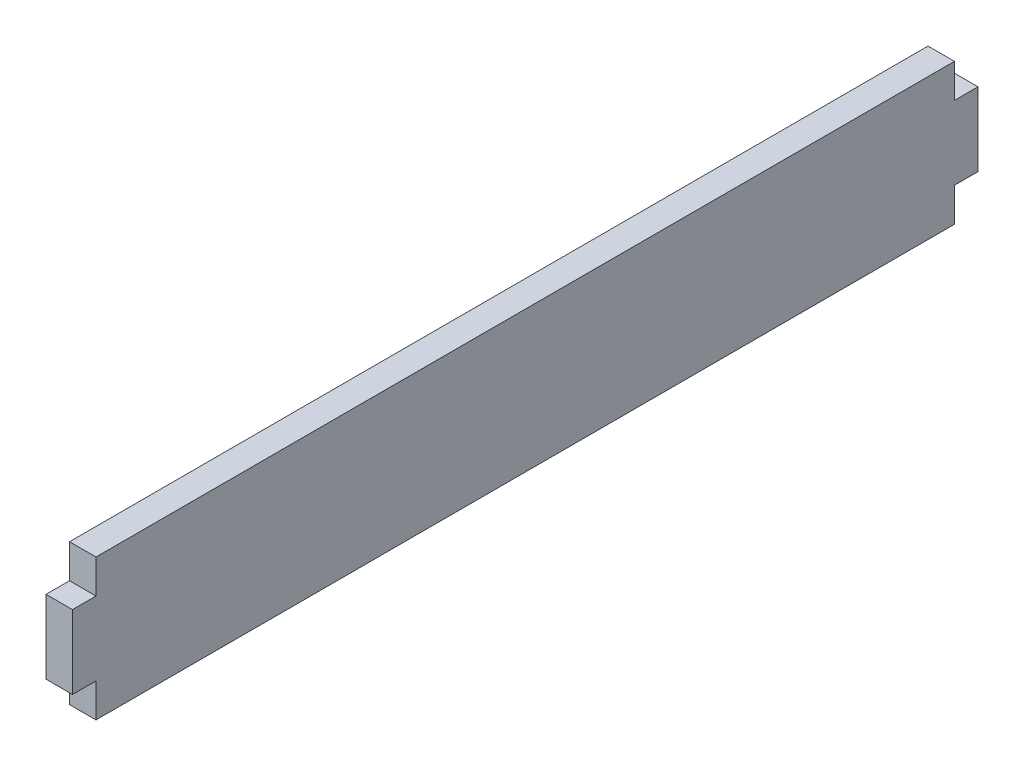
ISO-10303-21;
HEADER;
FILE_DESCRIPTION(('STEP AP214'),'2;1');
FILE_NAME('part.step','',(''),(''),'','','');
FILE_SCHEMA(('AUTOMOTIVE_DESIGN { 1 0 10303 214 1 1 1 1 }'));
ENDSEC;
DATA;
#1=APPLICATION_CONTEXT('core data for automotive mechanical design processes');
#2=APPLICATION_PROTOCOL_DEFINITION('international standard','automotive_design',2000,#1);
#3=PRODUCT_CONTEXT('',#1,'mechanical');
#4=PRODUCT('Part','Part','',(#3));
#5=PRODUCT_RELATED_PRODUCT_CATEGORY('part','',(#4));
#6=PRODUCT_DEFINITION_FORMATION('','',#4);
#7=PRODUCT_DEFINITION_CONTEXT('part definition',#1,'design');
#8=PRODUCT_DEFINITION('design','',#6,#7);
#9=PRODUCT_DEFINITION_SHAPE('','',#8);
#10=(LENGTH_UNIT() NAMED_UNIT(*) SI_UNIT(.MILLI.,.METRE.));
#11=(NAMED_UNIT(*) PLANE_ANGLE_UNIT() SI_UNIT($,.RADIAN.));
#12=(NAMED_UNIT(*) SI_UNIT($,.STERADIAN.) SOLID_ANGLE_UNIT());
#13=UNCERTAINTY_MEASURE_WITH_UNIT(LENGTH_MEASURE(1.E-05),#10,'distance_accuracy_value','');
#14=(GEOMETRIC_REPRESENTATION_CONTEXT(3) GLOBAL_UNCERTAINTY_ASSIGNED_CONTEXT((#13)) GLOBAL_UNIT_ASSIGNED_CONTEXT((#10,
#11,#12)) REPRESENTATION_CONTEXT('',''));
#15=CARTESIAN_POINT('',(0.,0.,0.));
#16=DIRECTION('',(0.,0.,1.));
#17=DIRECTION('',(1.,0.,0.));
#18=AXIS2_PLACEMENT_3D('',#15,#16,#17);
#19=CARTESIAN_POINT('',(18.,148.246124222782,20.354138571395));
#20=DIRECTION('',(0.,0.,-1.));
#21=DIRECTION('',(0.,1.,0.));
#22=AXIS2_PLACEMENT_3D('',#19,#20,#21);
#23=PLANE('',#22);
#24=DIRECTION('',(0.,-1.,0.));
#25=VECTOR('',#24,1.);
#26=CARTESIAN_POINT('',(0.,148.246124222782,20.354138571395));
#27=LINE('',#26,#25);
#28=CARTESIAN_POINT('',(0.,148.246124222782,20.354138571395));
#29=VERTEX_POINT('',#28);
#30=CARTESIAN_POINT('',(0.,125.246124222782,20.354138571395));
#31=VERTEX_POINT('',#30);
#32=EDGE_CURVE('E153',#29,#31,#27,.T.);
#33=ORIENTED_EDGE('',*,*,#32,.T.);
#34=DIRECTION('',(-1.,0.,0.));
#35=VECTOR('',#34,1.);
#36=CARTESIAN_POINT('',(18.,125.246124222782,20.354138571395));
#37=LINE('',#36,#35);
#38=CARTESIAN_POINT('',(18.,125.246124222782,20.354138571395));
#39=VERTEX_POINT('',#38);
#40=EDGE_CURVE('E11',#39,#31,#37,.T.);
#41=ORIENTED_EDGE('',*,*,#40,.F.);
#42=DIRECTION('',(0.,-1.,0.));
#43=VECTOR('',#42,1.);
#44=CARTESIAN_POINT('',(18.,148.246124222782,20.354138571395));
#45=LINE('',#44,#43);
#46=CARTESIAN_POINT('',(18.,148.246124222782,20.354138571395));
#47=VERTEX_POINT('',#46);
#48=EDGE_CURVE('E175',#47,#39,#45,.T.);
#49=ORIENTED_EDGE('',*,*,#48,.F.);
#50=DIRECTION('',(-1.,0.,0.));
#51=VECTOR('',#50,1.);
#52=CARTESIAN_POINT('',(18.,148.246124222782,20.354138571395));
#53=LINE('',#52,#51);
#54=EDGE_CURVE('E149',#47,#29,#53,.T.);
#55=ORIENTED_EDGE('',*,*,#54,.T.);
#56=EDGE_LOOP('',(#33,#41,#49,#55));
#57=FACE_BOUND('',#56,.T.);
#58=ADVANCED_FACE('F33',(#57),#23,.F.);
#59=CARTESIAN_POINT('',(18.,125.246124222782,20.354138571395));
#60=DIRECTION('',(0.,-1.,0.));
#61=DIRECTION('',(0.,0.,-1.));
#62=AXIS2_PLACEMENT_3D('',#59,#60,#61);
#63=PLANE('',#62);
#64=DIRECTION('',(0.,0.,1.));
#65=VECTOR('',#64,1.);
#66=CARTESIAN_POINT('',(0.,125.246124222782,20.354138571395));
#67=LINE('',#66,#65);
#68=CARTESIAN_POINT('',(0.,125.246124222782,36.3541385713949));
#69=VERTEX_POINT('',#68);
#70=EDGE_CURVE('E156',#31,#69,#67,.T.);
#71=ORIENTED_EDGE('',*,*,#70,.T.);
#72=DIRECTION('',(-1.,0.,0.));
#73=VECTOR('',#72,1.);
#74=CARTESIAN_POINT('',(18.,125.246124222782,36.3541385713949));
#75=LINE('',#74,#73);
#76=CARTESIAN_POINT('',(18.,125.246124222782,36.3541385713949));
#77=VERTEX_POINT('',#76);
#78=EDGE_CURVE('E41',#77,#69,#75,.T.);
#79=ORIENTED_EDGE('',*,*,#78,.F.);
#80=DIRECTION('',(0.,0.,1.));
#81=VECTOR('',#80,1.);
#82=CARTESIAN_POINT('',(18.,125.246124222782,20.354138571395));
#83=LINE('',#82,#81);
#84=EDGE_CURVE('E104',#39,#77,#83,.T.);
#85=ORIENTED_EDGE('',*,*,#84,.F.);
#86=ORIENTED_EDGE('',*,*,#40,.T.);
#87=EDGE_LOOP('',(#71,#79,#85,#86));
#88=FACE_BOUND('',#87,.T.);
#89=ADVANCED_FACE('F253',(#88),#63,.F.);
#90=CARTESIAN_POINT('',(18.,125.246124222782,36.3541385713949));
#91=DIRECTION('',(0.,0.,-1.));
#92=DIRECTION('',(-1.,0.,0.));
#93=AXIS2_PLACEMENT_3D('',#90,#91,#92);
#94=PLANE('',#93);
#95=DIRECTION('',(0.,-1.,0.));
#96=VECTOR('',#95,1.);
#97=CARTESIAN_POINT('',(0.,125.246124222782,36.3541385713949));
#98=LINE('',#97,#96);
#99=CARTESIAN_POINT('',(0.,75.2461242227819,36.3541385713949));
#100=VERTEX_POINT('',#99);
#101=EDGE_CURVE('E158',#69,#100,#98,.T.);
#102=ORIENTED_EDGE('',*,*,#101,.T.);
#103=DIRECTION('',(-1.,0.,0.));
#104=VECTOR('',#103,1.);
#105=CARTESIAN_POINT('',(18.,75.2461242227819,36.3541385713949));
#106=LINE('',#105,#104);
#107=CARTESIAN_POINT('',(18.,75.2461242227819,36.3541385713949));
#108=VERTEX_POINT('',#107);
#109=EDGE_CURVE('E194',#108,#100,#106,.T.);
#110=ORIENTED_EDGE('',*,*,#109,.F.);
#111=DIRECTION('',(0.,-1.,0.));
#112=VECTOR('',#111,1.);
#113=CARTESIAN_POINT('',(18.,125.246124222782,36.3541385713949));
#114=LINE('',#113,#112);
#115=EDGE_CURVE('E202',#77,#108,#114,.T.);
#116=ORIENTED_EDGE('',*,*,#115,.F.);
#117=ORIENTED_EDGE('',*,*,#78,.T.);
#118=EDGE_LOOP('',(#102,#110,#116,#117));
#119=FACE_BOUND('',#118,.T.);
#120=ADVANCED_FACE('F200',(#119),#94,.F.);
#121=CARTESIAN_POINT('',(18.,75.2461242227819,20.354138571395));
#122=DIRECTION('',(0.,1.,0.));
#123=DIRECTION('',(0.,0.,1.));
#124=AXIS2_PLACEMENT_3D('',#121,#122,#123);
#125=PLANE('',#124);
#126=DIRECTION('',(0.,0.,-1.));
#127=VECTOR('',#126,1.);
#128=CARTESIAN_POINT('',(0.,75.2461242227819,20.354138571395));
#129=LINE('',#128,#127);
#130=CARTESIAN_POINT('',(0.,75.2461242227819,20.354138571395));
#131=VERTEX_POINT('',#130);
#132=EDGE_CURVE('E160',#100,#131,#129,.T.);
#133=ORIENTED_EDGE('',*,*,#132,.T.);
#134=DIRECTION('',(-1.,0.,0.));
#135=VECTOR('',#134,1.);
#136=CARTESIAN_POINT('',(18.,75.2461242227819,20.354138571395));
#137=LINE('',#136,#135);
#138=CARTESIAN_POINT('',(18.,75.2461242227819,20.354138571395));
#139=VERTEX_POINT('',#138);
#140=EDGE_CURVE('E191',#139,#131,#137,.T.);
#141=ORIENTED_EDGE('',*,*,#140,.F.);
#142=DIRECTION('',(0.,0.,-1.));
#143=VECTOR('',#142,1.);
#144=CARTESIAN_POINT('',(18.,75.2461242227819,20.354138571395));
#145=LINE('',#144,#143);
#146=EDGE_CURVE('E220',#108,#139,#145,.T.);
#147=ORIENTED_EDGE('',*,*,#146,.F.);
#148=ORIENTED_EDGE('',*,*,#109,.T.);
#149=EDGE_LOOP('',(#133,#141,#147,#148));
#150=FACE_BOUND('',#149,.T.);
#151=ADVANCED_FACE('F211',(#150),#125,.F.);
#152=CARTESIAN_POINT('',(18.,75.2461242227819,20.354138571395));
#153=DIRECTION('',(0.,0.,-1.));
#154=DIRECTION('',(0.,1.,0.));
#155=AXIS2_PLACEMENT_3D('',#152,#153,#154);
#156=PLANE('',#155);
#157=DIRECTION('',(0.,-1.,0.));
#158=VECTOR('',#157,1.);
#159=CARTESIAN_POINT('',(0.,75.2461242227819,20.354138571395));
#160=LINE('',#159,#158);
#161=CARTESIAN_POINT('',(0.,52.2461242227819,20.354138571395));
#162=VERTEX_POINT('',#161);
#163=EDGE_CURVE('E162',#131,#162,#160,.T.);
#164=ORIENTED_EDGE('',*,*,#163,.T.);
#165=DIRECTION('',(-1.,0.,0.));
#166=VECTOR('',#165,1.);
#167=CARTESIAN_POINT('',(18.,52.2461242227819,20.354138571395));
#168=LINE('',#167,#166);
#169=CARTESIAN_POINT('',(18.,52.2461242227819,20.354138571395));
#170=VERTEX_POINT('',#169);
#171=EDGE_CURVE('E188',#170,#162,#168,.T.);
#172=ORIENTED_EDGE('',*,*,#171,.F.);
#173=DIRECTION('',(0.,-1.,0.));
#174=VECTOR('',#173,1.);
#175=CARTESIAN_POINT('',(18.,75.2461242227819,20.354138571395));
#176=LINE('',#175,#174);
#177=EDGE_CURVE('E217',#139,#170,#176,.T.);
#178=ORIENTED_EDGE('',*,*,#177,.F.);
#179=ORIENTED_EDGE('',*,*,#140,.T.);
#180=EDGE_LOOP('',(#164,#172,#178,#179));
#181=FACE_BOUND('',#180,.T.);
#182=ADVANCED_FACE('F215',(#181),#156,.F.);
#183=CARTESIAN_POINT('',(18.,52.2461242227819,20.354138571395));
#184=DIRECTION('',(0.,1.,0.));
#185=DIRECTION('',(0.,0.,1.));
#186=AXIS2_PLACEMENT_3D('',#183,#184,#185);
#187=PLANE('',#186);
#188=DIRECTION('',(0.,0.,-1.));
#189=VECTOR('',#188,1.);
#190=CARTESIAN_POINT('',(0.,52.2461242227819,20.354138571395));
#191=LINE('',#190,#189);
#192=CARTESIAN_POINT('',(0.,52.2461242227819,-563.645861428605));
#193=VERTEX_POINT('',#192);
#194=EDGE_CURVE('E164',#162,#193,#191,.T.);
#195=ORIENTED_EDGE('',*,*,#194,.T.);
#196=DIRECTION('',(-1.,0.,0.));
#197=VECTOR('',#196,1.);
#198=CARTESIAN_POINT('',(18.,52.2461242227819,-563.645861428605));
#199=LINE('',#198,#197);
#200=CARTESIAN_POINT('',(18.,52.2461242227819,-563.645861428605));
#201=VERTEX_POINT('',#200);
#202=EDGE_CURVE('E185',#201,#193,#199,.T.);
#203=ORIENTED_EDGE('',*,*,#202,.F.);
#204=DIRECTION('',(0.,0.,-1.));
#205=VECTOR('',#204,1.);
#206=CARTESIAN_POINT('',(18.,52.2461242227819,20.354138571395));
#207=LINE('',#206,#205);
#208=EDGE_CURVE('E219',#170,#201,#207,.T.);
#209=ORIENTED_EDGE('',*,*,#208,.F.);
#210=ORIENTED_EDGE('',*,*,#171,.T.);
#211=EDGE_LOOP('',(#195,#203,#209,#210));
#212=FACE_BOUND('',#211,.T.);
#213=ADVANCED_FACE('F266',(#212),#187,.F.);
#214=CARTESIAN_POINT('',(18.,75.2461242227819,-563.645861428605));
#215=DIRECTION('',(0.,0.,1.));
#216=DIRECTION('',(1.,0.,0.));
#217=AXIS2_PLACEMENT_3D('',#214,#215,#216);
#218=PLANE('',#217);
#219=DIRECTION('',(0.,1.,0.));
#220=VECTOR('',#219,1.);
#221=CARTESIAN_POINT('',(0.,75.2461242227819,-563.645861428605));
#222=LINE('',#221,#220);
#223=CARTESIAN_POINT('',(0.,75.2461242227819,-563.645861428605));
#224=VERTEX_POINT('',#223);
#225=EDGE_CURVE('E166',#193,#224,#222,.T.);
#226=ORIENTED_EDGE('',*,*,#225,.T.);
#227=DIRECTION('',(-1.,0.,0.));
#228=VECTOR('',#227,1.);
#229=CARTESIAN_POINT('',(18.,75.2461242227819,-563.645861428605));
#230=LINE('',#229,#228);
#231=CARTESIAN_POINT('',(18.,75.2461242227819,-563.645861428605));
#232=VERTEX_POINT('',#231);
#233=EDGE_CURVE('E182',#232,#224,#230,.T.);
#234=ORIENTED_EDGE('',*,*,#233,.F.);
#235=DIRECTION('',(0.,1.,0.));
#236=VECTOR('',#235,1.);
#237=CARTESIAN_POINT('',(18.,75.2461242227819,-563.645861428605));
#238=LINE('',#237,#236);
#239=EDGE_CURVE('E222',#201,#232,#238,.T.);
#240=ORIENTED_EDGE('',*,*,#239,.F.);
#241=ORIENTED_EDGE('',*,*,#202,.T.);
#242=EDGE_LOOP('',(#226,#234,#240,#241));
#243=FACE_BOUND('',#242,.T.);
#244=ADVANCED_FACE('F269',(#243),#218,.F.);
#245=CARTESIAN_POINT('',(18.,75.2461242227819,-563.645861428605));
#246=DIRECTION('',(0.,1.,0.));
#247=DIRECTION('',(0.,0.,1.));
#248=AXIS2_PLACEMENT_3D('',#245,#246,#247);
#249=PLANE('',#248);
#250=DIRECTION('',(0.,0.,-1.));
#251=VECTOR('',#250,1.);
#252=CARTESIAN_POINT('',(0.,75.2461242227819,-563.645861428605));
#253=LINE('',#252,#251);
#254=CARTESIAN_POINT('',(0.,75.2461242227819,-579.645861428605));
#255=VERTEX_POINT('',#254);
#256=EDGE_CURVE('E168',#224,#255,#253,.T.);
#257=ORIENTED_EDGE('',*,*,#256,.T.);
#258=DIRECTION('',(-1.,0.,0.));
#259=VECTOR('',#258,1.);
#260=CARTESIAN_POINT('',(18.,75.2461242227819,-579.645861428605));
#261=LINE('',#260,#259);
#262=CARTESIAN_POINT('',(18.,75.2461242227819,-579.645861428605));
#263=VERTEX_POINT('',#262);
#264=EDGE_CURVE('E179',#263,#255,#261,.T.);
#265=ORIENTED_EDGE('',*,*,#264,.F.);
#266=DIRECTION('',(0.,0.,-1.));
#267=VECTOR('',#266,1.);
#268=CARTESIAN_POINT('',(18.,75.2461242227819,-563.645861428605));
#269=LINE('',#268,#267);
#270=EDGE_CURVE('E228',#232,#263,#269,.T.);
#271=ORIENTED_EDGE('',*,*,#270,.F.);
#272=ORIENTED_EDGE('',*,*,#233,.T.);
#273=EDGE_LOOP('',(#257,#265,#271,#272));
#274=FACE_BOUND('',#273,.T.);
#275=ADVANCED_FACE('F234',(#274),#249,.F.);
#276=CARTESIAN_POINT('',(18.,125.246124222782,-579.645861428605));
#277=DIRECTION('',(0.,0.,1.));
#278=DIRECTION('',(1.,0.,0.));
#279=AXIS2_PLACEMENT_3D('',#276,#277,#278);
#280=PLANE('',#279);
#281=DIRECTION('',(0.,1.,0.));
#282=VECTOR('',#281,1.);
#283=CARTESIAN_POINT('',(0.,125.246124222782,-579.645861428605));
#284=LINE('',#283,#282);
#285=CARTESIAN_POINT('',(0.,125.246124222782,-579.645861428605));
#286=VERTEX_POINT('',#285);
#287=EDGE_CURVE('E170',#255,#286,#284,.T.);
#288=ORIENTED_EDGE('',*,*,#287,.T.);
#289=DIRECTION('',(-1.,0.,0.));
#290=VECTOR('',#289,1.);
#291=CARTESIAN_POINT('',(18.,125.246124222782,-579.645861428605));
#292=LINE('',#291,#290);
#293=CARTESIAN_POINT('',(18.,125.246124222782,-579.645861428605));
#294=VERTEX_POINT('',#293);
#295=EDGE_CURVE('E144',#294,#286,#292,.T.);
#296=ORIENTED_EDGE('',*,*,#295,.F.);
#297=DIRECTION('',(0.,1.,0.));
#298=VECTOR('',#297,1.);
#299=CARTESIAN_POINT('',(18.,125.246124222782,-579.645861428605));
#300=LINE('',#299,#298);
#301=EDGE_CURVE('E135',#263,#294,#300,.T.);
#302=ORIENTED_EDGE('',*,*,#301,.F.);
#303=ORIENTED_EDGE('',*,*,#264,.T.);
#304=EDGE_LOOP('',(#288,#296,#302,#303));
#305=FACE_BOUND('',#304,.T.);
#306=ADVANCED_FACE('F238',(#305),#280,.F.);
#307=CARTESIAN_POINT('',(18.,125.246124222782,-563.645861428605));
#308=DIRECTION('',(0.,-1.,0.));
#309=DIRECTION('',(0.,0.,-1.));
#310=AXIS2_PLACEMENT_3D('',#307,#308,#309);
#311=PLANE('',#310);
#312=DIRECTION('',(0.,0.,1.));
#313=VECTOR('',#312,1.);
#314=CARTESIAN_POINT('',(0.,125.246124222782,-563.645861428605));
#315=LINE('',#314,#313);
#316=CARTESIAN_POINT('',(0.,125.246124222782,-563.645861428605));
#317=VERTEX_POINT('',#316);
#318=EDGE_CURVE('E143',#286,#317,#315,.T.);
#319=ORIENTED_EDGE('',*,*,#318,.T.);
#320=DIRECTION('',(-1.,0.,0.));
#321=VECTOR('',#320,1.);
#322=CARTESIAN_POINT('',(18.,125.246124222782,-563.645861428605));
#323=LINE('',#322,#321);
#324=CARTESIAN_POINT('',(18.,125.246124222782,-563.645861428605));
#325=VERTEX_POINT('',#324);
#326=EDGE_CURVE('E140',#325,#317,#323,.T.);
#327=ORIENTED_EDGE('',*,*,#326,.F.);
#328=DIRECTION('',(0.,0.,1.));
#329=VECTOR('',#328,1.);
#330=CARTESIAN_POINT('',(18.,125.246124222782,-563.645861428605));
#331=LINE('',#330,#329);
#332=EDGE_CURVE('E129',#294,#325,#331,.T.);
#333=ORIENTED_EDGE('',*,*,#332,.F.);
#334=ORIENTED_EDGE('',*,*,#295,.T.);
#335=EDGE_LOOP('',(#319,#327,#333,#334));
#336=FACE_BOUND('',#335,.T.);
#337=ADVANCED_FACE('F141',(#336),#311,.F.);
#338=CARTESIAN_POINT('',(18.,148.246124222782,-563.645861428605));
#339=DIRECTION('',(0.,0.,1.));
#340=DIRECTION('',(1.,0.,0.));
#341=AXIS2_PLACEMENT_3D('',#338,#339,#340);
#342=PLANE('',#341);
#343=DIRECTION('',(0.,1.,0.));
#344=VECTOR('',#343,1.);
#345=CARTESIAN_POINT('',(0.,148.246124222782,-563.645861428605));
#346=LINE('',#345,#344);
#347=CARTESIAN_POINT('',(0.,148.246124222782,-563.645861428605));
#348=VERTEX_POINT('',#347);
#349=EDGE_CURVE('E90',#317,#348,#346,.T.);
#350=ORIENTED_EDGE('',*,*,#349,.T.);
#351=DIRECTION('',(-1.,0.,0.));
#352=VECTOR('',#351,1.);
#353=CARTESIAN_POINT('',(18.,148.246124222782,-563.645861428605));
#354=LINE('',#353,#352);
#355=CARTESIAN_POINT('',(18.,148.246124222782,-563.645861428605));
#356=VERTEX_POINT('',#355);
#357=EDGE_CURVE('E145',#356,#348,#354,.T.);
#358=ORIENTED_EDGE('',*,*,#357,.F.);
#359=DIRECTION('',(0.,1.,0.));
#360=VECTOR('',#359,1.);
#361=CARTESIAN_POINT('',(18.,148.246124222782,-563.645861428605));
#362=LINE('',#361,#360);
#363=EDGE_CURVE('E133',#325,#356,#362,.T.);
#364=ORIENTED_EDGE('',*,*,#363,.F.);
#365=ORIENTED_EDGE('',*,*,#326,.T.);
#366=EDGE_LOOP('',(#350,#358,#364,#365));
#367=FACE_BOUND('',#366,.T.);
#368=ADVANCED_FACE('F147',(#367),#342,.F.);
#369=CARTESIAN_POINT('',(18.,148.246124222782,20.354138571395));
#370=DIRECTION('',(0.,-1.,0.));
#371=DIRECTION('',(0.,0.,-1.));
#372=AXIS2_PLACEMENT_3D('',#369,#370,#371);
#373=PLANE('',#372);
#374=DIRECTION('',(0.,0.,1.));
#375=VECTOR('',#374,1.);
#376=CARTESIAN_POINT('',(0.,148.246124222782,20.354138571395));
#377=LINE('',#376,#375);
#378=EDGE_CURVE('E96',#348,#29,#377,.T.);
#379=ORIENTED_EDGE('',*,*,#378,.T.);
#380=ORIENTED_EDGE('',*,*,#54,.F.);
#381=DIRECTION('',(0.,0.,1.));
#382=VECTOR('',#381,1.);
#383=CARTESIAN_POINT('',(18.,148.246124222782,20.354138571395));
#384=LINE('',#383,#382);
#385=EDGE_CURVE('E49',#356,#47,#384,.T.);
#386=ORIENTED_EDGE('',*,*,#385,.F.);
#387=ORIENTED_EDGE('',*,*,#357,.T.);
#388=EDGE_LOOP('',(#379,#380,#386,#387));
#389=FACE_BOUND('',#388,.T.);
#390=ADVANCED_FACE('F242',(#389),#373,.F.);
#391=CARTESIAN_POINT('',(18.,0.,0.));
#392=DIRECTION('',(-1.,0.,0.));
#393=DIRECTION('',(0.,0.,1.));
#394=AXIS2_PLACEMENT_3D('',#391,#392,#393);
#395=PLANE('',#394);
#396=ORIENTED_EDGE('',*,*,#48,.T.);
#397=ORIENTED_EDGE('',*,*,#84,.T.);
#398=ORIENTED_EDGE('',*,*,#115,.T.);
#399=ORIENTED_EDGE('',*,*,#146,.T.);
#400=ORIENTED_EDGE('',*,*,#177,.T.);
#401=ORIENTED_EDGE('',*,*,#208,.T.);
#402=ORIENTED_EDGE('',*,*,#239,.T.);
#403=ORIENTED_EDGE('',*,*,#270,.T.);
#404=ORIENTED_EDGE('',*,*,#301,.T.);
#405=ORIENTED_EDGE('',*,*,#332,.T.);
#406=ORIENTED_EDGE('',*,*,#363,.T.);
#407=ORIENTED_EDGE('',*,*,#385,.T.);
#408=EDGE_LOOP('',(#396,#397,#398,#399,#400,#401,#402,#403,#404,#405,#406,#407));
#409=FACE_BOUND('',#408,.T.);
#410=ADVANCED_FACE('F131',(#409),#395,.F.);
#411=CARTESIAN_POINT('',(0.,0.,0.));
#412=DIRECTION('',(-1.,0.,0.));
#413=DIRECTION('',(0.,0.,1.));
#414=AXIS2_PLACEMENT_3D('',#411,#412,#413);
#415=PLANE('',#414);
#416=ORIENTED_EDGE('',*,*,#32,.F.);
#417=ORIENTED_EDGE('',*,*,#378,.F.);
#418=ORIENTED_EDGE('',*,*,#349,.F.);
#419=ORIENTED_EDGE('',*,*,#318,.F.);
#420=ORIENTED_EDGE('',*,*,#287,.F.);
#421=ORIENTED_EDGE('',*,*,#256,.F.);
#422=ORIENTED_EDGE('',*,*,#225,.F.);
#423=ORIENTED_EDGE('',*,*,#194,.F.);
#424=ORIENTED_EDGE('',*,*,#163,.F.);
#425=ORIENTED_EDGE('',*,*,#132,.F.);
#426=ORIENTED_EDGE('',*,*,#101,.F.);
#427=ORIENTED_EDGE('',*,*,#70,.F.);
#428=EDGE_LOOP('',(#416,#417,#418,#419,#420,#421,#422,#423,#424,#425,#426,#427));
#429=FACE_BOUND('',#428,.T.);
#430=ADVANCED_FACE('F206',(#429),#415,.T.);
#431=CLOSED_SHELL('',(#58,#89,#120,#151,#182,#213,#244,#275,#306,#337,#368,#390,#410,#430));
#432=MANIFOLD_SOLID_BREP('B2',#431);
#433=ADVANCED_BREP_SHAPE_REPRESENTATION('',(#18,#432),#14);
#434=SHAPE_DEFINITION_REPRESENTATION(#9,#433);
ENDSEC;
END-ISO-10303-21;
